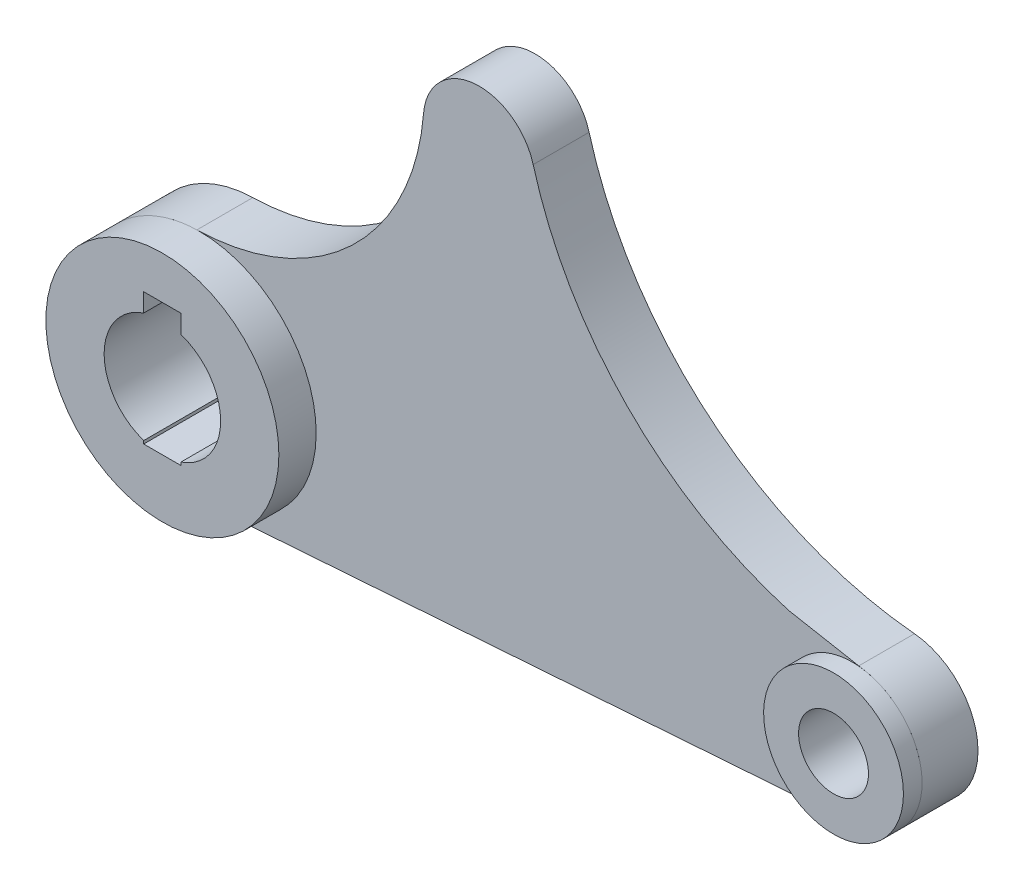
ISO-10303-21;
HEADER;
FILE_DESCRIPTION(('STEP AP214'),'2;1');
FILE_NAME('part.step','',(''),(''),'','','');
FILE_SCHEMA(('AUTOMOTIVE_DESIGN { 1 0 10303 214 1 1 1 1 }'));
ENDSEC;
DATA;
#1=APPLICATION_CONTEXT('core data for automotive mechanical design processes');
#2=APPLICATION_PROTOCOL_DEFINITION('international standard','automotive_design',2000,#1);
#3=PRODUCT_CONTEXT('',#1,'mechanical');
#4=PRODUCT('Part','Part','',(#3));
#5=PRODUCT_RELATED_PRODUCT_CATEGORY('part','',(#4));
#6=PRODUCT_DEFINITION_FORMATION('','',#4);
#7=PRODUCT_DEFINITION_CONTEXT('part definition',#1,'design');
#8=PRODUCT_DEFINITION('design','',#6,#7);
#9=PRODUCT_DEFINITION_SHAPE('','',#8);
#10=(LENGTH_UNIT() NAMED_UNIT(*) SI_UNIT(.MILLI.,.METRE.));
#11=(NAMED_UNIT(*) PLANE_ANGLE_UNIT() SI_UNIT($,.RADIAN.));
#12=(NAMED_UNIT(*) SI_UNIT($,.STERADIAN.) SOLID_ANGLE_UNIT());
#13=UNCERTAINTY_MEASURE_WITH_UNIT(LENGTH_MEASURE(1.E-05),#10,'distance_accuracy_value','');
#14=(GEOMETRIC_REPRESENTATION_CONTEXT(3) GLOBAL_UNCERTAINTY_ASSIGNED_CONTEXT((#13)) GLOBAL_UNIT_ASSIGNED_CONTEXT((#10,
#11,#12)) REPRESENTATION_CONTEXT('',''));
#15=CARTESIAN_POINT('',(0.,0.,0.));
#16=DIRECTION('',(0.,0.,1.));
#17=DIRECTION('',(1.,0.,0.));
#18=AXIS2_PLACEMENT_3D('',#15,#16,#17);
#19=CARTESIAN_POINT('',(0.,0.,0.));
#20=DIRECTION('',(0.,0.,1.));
#21=DIRECTION('',(1.,0.,0.));
#22=AXIS2_PLACEMENT_3D('',#19,#20,#21);
#23=CYLINDRICAL_SURFACE('',#22,12.5);
#24=CARTESIAN_POINT('',(0.,0.,20.));
#25=DIRECTION('',(0.,0.,1.));
#26=DIRECTION('',(1.,0.,0.));
#27=AXIS2_PLACEMENT_3D('',#24,#25,#26);
#28=CIRCLE('',#27,12.5);
#29=CARTESIAN_POINT('',(-4.,11.842719282327,20.));
#30=VERTEX_POINT('',#29);
#31=CARTESIAN_POINT('',(-4.,-11.842719282327,20.));
#32=VERTEX_POINT('',#31);
#33=EDGE_CURVE('E363',#30,#32,#28,.T.);
#34=ORIENTED_EDGE('',*,*,#33,.T.);
#35=DIRECTION('',(0.,0.,1.));
#36=VECTOR('',#35,1.);
#37=CARTESIAN_POINT('',(-4.,-11.842719282327,0.));
#38=LINE('',#37,#36);
#39=CARTESIAN_POINT('',(-4.,-11.842719282327,0.));
#40=VERTEX_POINT('',#39);
#41=EDGE_CURVE('E211',#32,#40,#38,.F.);
#42=ORIENTED_EDGE('',*,*,#41,.T.);
#43=CARTESIAN_POINT('',(0.,0.,0.));
#44=DIRECTION('',(0.,0.,1.));
#45=DIRECTION('',(1.,0.,0.));
#46=AXIS2_PLACEMENT_3D('',#43,#44,#45);
#47=CIRCLE('',#46,12.5);
#48=CARTESIAN_POINT('',(-4.,11.842719282327,0.));
#49=VERTEX_POINT('',#48);
#50=EDGE_CURVE('E378',#49,#40,#47,.T.);
#51=ORIENTED_EDGE('',*,*,#50,.F.);
#52=DIRECTION('',(0.,0.,1.));
#53=VECTOR('',#52,1.);
#54=CARTESIAN_POINT('',(-4.,11.842719282327,0.));
#55=LINE('',#54,#53);
#56=EDGE_CURVE('E215',#49,#30,#55,.T.);
#57=ORIENTED_EDGE('',*,*,#56,.T.);
#58=EDGE_LOOP('',(#34,#42,#51,#57));
#59=FACE_BOUND('',#58,.T.);
#60=ADVANCED_FACE('F45',(#59),#23,.F.);
#61=CARTESIAN_POINT('',(0.000402219123890948,-0.000374377429163478,12.));
#62=DIRECTION('',(0.,0.,-1.));
#63=DIRECTION('',(-1.,0.,0.));
#64=AXIS2_PLACEMENT_3D('',#61,#62,#63);
#65=CYLINDRICAL_SURFACE('',#64,24.9995540058325);
#66=CARTESIAN_POINT('',(0.000402219123890948,-0.000374377429163478,0.));
#67=DIRECTION('',(0.,0.,1.));
#68=DIRECTION('',(1.,0.,0.));
#69=AXIS2_PLACEMENT_3D('',#66,#67,#68);
#70=CIRCLE('',#69,24.9995540058325);
#71=CARTESIAN_POINT('',(-0.598700000000013,24.992,0.));
#72=VERTEX_POINT('',#71);
#73=CARTESIAN_POINT('',(1.7857,-24.9361,0.));
#74=VERTEX_POINT('',#73);
#75=EDGE_CURVE('E263',#72,#74,#70,.T.);
#76=ORIENTED_EDGE('',*,*,#75,.T.);
#77=DIRECTION('',(0.,0.,-1.));
#78=VECTOR('',#77,1.);
#79=CARTESIAN_POINT('',(1.7857,-24.9361,12.));
#80=LINE('',#79,#78);
#81=CARTESIAN_POINT('',(1.7857,-24.9361,12.));
#82=VERTEX_POINT('',#81);
#83=EDGE_CURVE('E303',#82,#74,#80,.T.);
#84=ORIENTED_EDGE('',*,*,#83,.F.);
#85=CARTESIAN_POINT('',(0.000402219123890948,-0.000374377429163478,12.));
#86=DIRECTION('',(0.,0.,1.));
#87=DIRECTION('',(1.,0.,0.));
#88=AXIS2_PLACEMENT_3D('',#85,#86,#87);
#89=CIRCLE('',#88,24.9995540058325);
#90=CARTESIAN_POINT('',(-0.598700000000013,24.992,12.));
#91=VERTEX_POINT('',#90);
#92=EDGE_CURVE('E283',#91,#82,#89,.T.);
#93=ORIENTED_EDGE('',*,*,#92,.F.);
#94=DIRECTION('',(0.,0.,-1.));
#95=VECTOR('',#94,1.);
#96=CARTESIAN_POINT('',(-0.598700000000013,24.992,12.));
#97=LINE('',#96,#95);
#98=EDGE_CURVE('E262',#91,#72,#97,.T.);
#99=ORIENTED_EDGE('',*,*,#98,.T.);
#100=EDGE_LOOP('',(#76,#84,#93,#99));
#101=FACE_BOUND('',#100,.T.);
#102=ADVANCED_FACE('F47',(#101),#65,.T.);
#103=CARTESIAN_POINT('',(1.7857,-24.9361,12.));
#104=DIRECTION('',(-0.0714281713737014,0.997445746060511,0.));
#105=DIRECTION('',(-0.997445746060511,-0.0714281713737014,0.));
#106=AXIS2_PLACEMENT_3D('',#103,#104,#105);
#107=PLANE('',#106);
#108=DIRECTION('',(0.997445746060511,0.0714281713737014,0.));
#109=VECTOR('',#108,1.);
#110=CARTESIAN_POINT('',(1.7857,-24.9361,0.));
#111=LINE('',#110,#109);
#112=CARTESIAN_POINT('',(141.0714,-14.9617,0.));
#113=VERTEX_POINT('',#112);
#114=EDGE_CURVE('E267',#74,#113,#111,.T.);
#115=ORIENTED_EDGE('',*,*,#114,.T.);
#116=DIRECTION('',(0.,0.,-1.));
#117=VECTOR('',#116,1.);
#118=CARTESIAN_POINT('',(141.0714,-14.9617,12.));
#119=LINE('',#118,#117);
#120=CARTESIAN_POINT('',(141.0714,-14.9617,12.));
#121=VERTEX_POINT('',#120);
#122=EDGE_CURVE('E299',#121,#113,#119,.T.);
#123=ORIENTED_EDGE('',*,*,#122,.F.);
#124=DIRECTION('',(0.997445746060511,0.0714281713737014,0.));
#125=VECTOR('',#124,1.);
#126=CARTESIAN_POINT('',(1.7857,-24.9361,12.));
#127=LINE('',#126,#125);
#128=CARTESIAN_POINT('',(1.8324035606038,-24.932755507386,12.));
#129=VERTEX_POINT('',#128);
#130=EDGE_CURVE('E452',#129,#121,#127,.T.);
#131=ORIENTED_EDGE('',*,*,#130,.F.);
#132=EDGE_CURVE('E244',#82,#129,#127,.T.);
#133=ORIENTED_EDGE('',*,*,#132,.F.);
#134=ORIENTED_EDGE('',*,*,#83,.T.);
#135=EDGE_LOOP('',(#115,#123,#131,#133,#134));
#136=FACE_BOUND('',#135,.T.);
#137=ADVANCED_FACE('F328',(#136),#107,.F.);
#138=CARTESIAN_POINT('',(139.999830405286,0.000159451017999433,12.));
#139=DIRECTION('',(0.,0.,-1.));
#140=DIRECTION('',(-1.,0.,0.));
#141=AXIS2_PLACEMENT_3D('',#138,#139,#140);
#142=CYLINDRICAL_SURFACE('',#141,15.0001833198242);
#143=CARTESIAN_POINT('',(139.999830405286,0.000159451017999433,0.));
#144=DIRECTION('',(0.,0.,1.));
#145=DIRECTION('',(1.,0.,0.));
#146=AXIS2_PLACEMENT_3D('',#143,#144,#145);
#147=CIRCLE('',#146,15.0001833198242);
#148=CARTESIAN_POINT('',(141.366,14.938,0.));
#149=VERTEX_POINT('',#148);
#150=EDGE_CURVE('E271',#113,#149,#147,.T.);
#151=ORIENTED_EDGE('',*,*,#150,.T.);
#152=DIRECTION('',(0.,0.,-1.));
#153=VECTOR('',#152,1.);
#154=CARTESIAN_POINT('',(141.366,14.938,12.));
#155=LINE('',#154,#153);
#156=CARTESIAN_POINT('',(141.366,14.938,12.));
#157=VERTEX_POINT('',#156);
#158=EDGE_CURVE('E295',#157,#149,#155,.T.);
#159=ORIENTED_EDGE('',*,*,#158,.F.);
#160=CARTESIAN_POINT('',(139.999830405286,0.000159451017999433,12.));
#161=DIRECTION('',(0.,0.,1.));
#162=DIRECTION('',(1.,0.,0.));
#163=AXIS2_PLACEMENT_3D('',#160,#161,#162);
#164=CIRCLE('',#163,15.0001833198242);
#165=CARTESIAN_POINT('',(154.938540983483,-1.35646352137157,12.));
#166=VERTEX_POINT('',#165);
#167=EDGE_CURVE('E239',#166,#157,#164,.T.);
#168=ORIENTED_EDGE('',*,*,#167,.F.);
#169=CARTESIAN_POINT('',(140.,0.,12.));
#170=DIRECTION('',(0.,0.,1.));
#171=DIRECTION('',(0.151603502002802,-0.988441388338472,0.));
#172=AXIS2_PLACEMENT_3D('',#169,#170,#171);
#173=CIRCLE('',#172,15.);
#174=CARTESIAN_POINT('',(142.274052530042,-14.8266208250771,12.));
#175=VERTEX_POINT('',#174);
#176=EDGE_CURVE('E243',#175,#166,#173,.T.);
#177=ORIENTED_EDGE('',*,*,#176,.F.);
#178=EDGE_CURVE('E245',#121,#175,#164,.T.);
#179=ORIENTED_EDGE('',*,*,#178,.F.);
#180=ORIENTED_EDGE('',*,*,#122,.T.);
#181=EDGE_LOOP('',(#151,#159,#168,#177,#179,#180));
#182=FACE_BOUND('',#181,.T.);
#183=ADVANCED_FACE('F318',(#182),#142,.T.);
#184=CARTESIAN_POINT('',(148.649606252842,94.6071611996893,12.));
#185=DIRECTION('',(0.,0.,-1.));
#186=DIRECTION('',(-1.,0.,0.));
#187=AXIS2_PLACEMENT_3D('',#184,#185,#186);
#188=CYLINDRICAL_SURFACE('',#187,80.0014135269403);
#189=CARTESIAN_POINT('',(148.649606252842,94.6071611996893,0.));
#190=DIRECTION('',(0.,0.,-1.));
#191=DIRECTION('',(-1.,0.,0.));
#192=AXIS2_PLACEMENT_3D('',#189,#190,#191);
#193=CIRCLE('',#192,80.0014135269403);
#194=CARTESIAN_POINT('',(71.563,73.209,0.));
#195=VERTEX_POINT('',#194);
#196=EDGE_CURVE('E274',#149,#195,#193,.T.);
#197=ORIENTED_EDGE('',*,*,#196,.T.);
#198=DIRECTION('',(0.,0.,-1.));
#199=VECTOR('',#198,1.);
#200=CARTESIAN_POINT('',(71.563,73.209,12.));
#201=LINE('',#200,#199);
#202=CARTESIAN_POINT('',(71.563,73.209,12.));
#203=VERTEX_POINT('',#202);
#204=EDGE_CURVE('E291',#203,#195,#201,.T.);
#205=ORIENTED_EDGE('',*,*,#204,.F.);
#206=CARTESIAN_POINT('',(148.649606252842,94.6071611996893,12.));
#207=DIRECTION('',(0.,0.,-1.));
#208=DIRECTION('',(-1.,0.,0.));
#209=AXIS2_PLACEMENT_3D('',#206,#207,#208);
#210=CIRCLE('',#209,80.0014135269403);
#211=EDGE_CURVE('E251',#157,#203,#210,.T.);
#212=ORIENTED_EDGE('',*,*,#211,.F.);
#213=ORIENTED_EDGE('',*,*,#158,.T.);
#214=EDGE_LOOP('',(#197,#205,#212,#213));
#215=FACE_BOUND('',#214,.T.);
#216=ADVANCED_FACE('F327',(#215),#188,.F.);
#217=CARTESIAN_POINT('',(60.0003644791306,70.0005299635653,12.));
#218=DIRECTION('',(0.,0.,-1.));
#219=DIRECTION('',(-1.,0.,0.));
#220=AXIS2_PLACEMENT_3D('',#217,#218,#219);
#221=CYLINDRICAL_SURFACE('',#220,11.9995341644236);
#222=CARTESIAN_POINT('',(60.0003644791306,70.0005299635653,0.));
#223=DIRECTION('',(0.,0.,1.));
#224=DIRECTION('',(1.,0.,0.));
#225=AXIS2_PLACEMENT_3D('',#222,#223,#224);
#226=CIRCLE('',#225,11.9995341644236);
#227=CARTESIAN_POINT('',(48.0395,70.9631,0.));
#228=VERTEX_POINT('',#227);
#229=EDGE_CURVE('E277',#195,#228,#226,.T.);
#230=ORIENTED_EDGE('',*,*,#229,.T.);
#231=DIRECTION('',(0.,0.,-1.));
#232=VECTOR('',#231,1.);
#233=CARTESIAN_POINT('',(48.0395,70.9631,12.));
#234=LINE('',#233,#232);
#235=CARTESIAN_POINT('',(48.0395,70.9631,12.));
#236=VERTEX_POINT('',#235);
#237=EDGE_CURVE('E287',#236,#228,#234,.T.);
#238=ORIENTED_EDGE('',*,*,#237,.F.);
#239=CARTESIAN_POINT('',(60.0003644791306,70.0005299635653,12.));
#240=DIRECTION('',(0.,0.,1.));
#241=DIRECTION('',(1.,0.,0.));
#242=AXIS2_PLACEMENT_3D('',#239,#240,#241);
#243=CIRCLE('',#242,11.9995341644236);
#244=EDGE_CURVE('E255',#203,#236,#243,.T.);
#245=ORIENTED_EDGE('',*,*,#244,.F.);
#246=ORIENTED_EDGE('',*,*,#204,.T.);
#247=EDGE_LOOP('',(#230,#238,#245,#246));
#248=FACE_BOUND('',#247,.T.);
#249=ADVANCED_FACE('F415',(#248),#221,.T.);
#250=CARTESIAN_POINT('',(-1.79683237748626,74.9752127016245,12.));
#251=DIRECTION('',(0.,0.,-1.));
#252=DIRECTION('',(-1.,0.,0.));
#253=AXIS2_PLACEMENT_3D('',#250,#251,#252);
#254=CYLINDRICAL_SURFACE('',#253,49.9975706726819);
#255=CARTESIAN_POINT('',(-1.79683237748626,74.9752127016245,0.));
#256=DIRECTION('',(0.,0.,-1.));
#257=DIRECTION('',(-1.,0.,0.));
#258=AXIS2_PLACEMENT_3D('',#255,#256,#257);
#259=CIRCLE('',#258,49.9975706726819);
#260=EDGE_CURVE('E280',#228,#72,#259,.T.);
#261=ORIENTED_EDGE('',*,*,#260,.T.);
#262=ORIENTED_EDGE('',*,*,#98,.F.);
#263=CARTESIAN_POINT('',(-1.79683237748626,74.9752127016245,12.));
#264=DIRECTION('',(0.,0.,-1.));
#265=DIRECTION('',(-1.,0.,0.));
#266=AXIS2_PLACEMENT_3D('',#263,#264,#265);
#267=CIRCLE('',#266,49.9975706726819);
#268=CARTESIAN_POINT('',(-0.432683514690021,24.9962554190846,12.));
#269=VERTEX_POINT('',#268);
#270=EDGE_CURVE('E258',#269,#91,#267,.T.);
#271=ORIENTED_EDGE('',*,*,#270,.F.);
#272=EDGE_CURVE('E259',#236,#269,#267,.T.);
#273=ORIENTED_EDGE('',*,*,#272,.F.);
#274=ORIENTED_EDGE('',*,*,#237,.T.);
#275=EDGE_LOOP('',(#261,#262,#271,#273,#274));
#276=FACE_BOUND('',#275,.T.);
#277=ADVANCED_FACE('F410',(#276),#254,.F.);
#278=CARTESIAN_POINT('',(0.000402219123890948,-0.000374377429163478,12.));
#279=DIRECTION('',(0.,0.,1.));
#280=DIRECTION('',(1.,0.,0.));
#281=AXIS2_PLACEMENT_3D('',#278,#279,#280);
#282=PLANE('',#281);
#283=CARTESIAN_POINT('',(70.4244385839701,14.9798186483,12.));
#284=DIRECTION('',(0.,0.,1.));
#285=DIRECTION('',(1.,0.,0.));
#286=AXIS2_PLACEMENT_3D('',#283,#284,#285);
#287=CIRCLE('',#286,4.00002356938401);
#288=CARTESIAN_POINT('',(66.514,14.138,12.));
#289=VERTEX_POINT('',#288);
#290=CARTESIAN_POINT('',(74.3392,15.8013,12.));
#291=VERTEX_POINT('',#290);
#292=EDGE_CURVE('E193',#289,#291,#287,.T.);
#293=ORIENTED_EDGE('',*,*,#292,.F.);
#294=CARTESIAN_POINT('',(0.00161020781769966,0.000820441417557355,12.));
#295=DIRECTION('',(0.,0.,1.));
#296=DIRECTION('',(1.,0.,0.));
#297=AXIS2_PLACEMENT_3D('',#294,#295,#296);
#298=CIRCLE('',#297,67.9982194012373);
#299=CARTESIAN_POINT('',(57.6673,36.0345,12.));
#300=VERTEX_POINT('',#299);
#301=EDGE_CURVE('E534',#300,#289,#298,.F.);
#302=ORIENTED_EDGE('',*,*,#301,.F.);
#303=CARTESIAN_POINT('',(61.0595,38.1542,12.));
#304=DIRECTION('',(0.,0.,1.));
#305=DIRECTION('',(1.,0.,0.));
#306=AXIS2_PLACEMENT_3D('',#303,#304,#305);
#307=CIRCLE('',#306,4.00001861620668);
#308=CARTESIAN_POINT('',(64.4517,40.2739,12.));
#309=VERTEX_POINT('',#308);
#310=EDGE_CURVE('E536',#309,#300,#307,.T.);
#311=ORIENTED_EDGE('',*,*,#310,.F.);
#312=CARTESIAN_POINT('',(-0.00226894669665134,-0.000693687040313057,12.));
#313=DIRECTION('',(0.,0.,1.));
#314=DIRECTION('',(1.,0.,0.));
#315=AXIS2_PLACEMENT_3D('',#312,#313,#314);
#316=CIRCLE('',#315,76.0023487113255);
#317=EDGE_CURVE('E540',#291,#309,#316,.T.);
#318=ORIENTED_EDGE('',*,*,#317,.F.);
#319=EDGE_LOOP('',(#293,#302,#311,#318));
#320=FACE_BOUND('',#319,.T.);
#321=CARTESIAN_POINT('',(60.,70.,12.));
#322=DIRECTION('',(0.,0.,1.));
#323=DIRECTION('',(1.,0.,0.));
#324=AXIS2_PLACEMENT_3D('',#321,#322,#323);
#325=CIRCLE('',#324,5.);
#326=CARTESIAN_POINT('',(65.,70.,12.));
#327=VERTEX_POINT('',#326);
#328=EDGE_CURVE('E232',#327,#327,#325,.T.);
#329=ORIENTED_EDGE('',*,*,#328,.F.);
#330=EDGE_LOOP('',(#329));
#331=FACE_BOUND('',#330,.T.);
#332=ORIENTED_EDGE('',*,*,#178,.T.);
#333=CARTESIAN_POINT('',(140.,0.,12.));
#334=DIRECTION('',(0.,0.,1.));
#335=DIRECTION('',(1.,0.,0.));
#336=AXIS2_PLACEMENT_3D('',#333,#334,#335);
#337=CIRCLE('',#336,15.);
#338=EDGE_CURVE('E227',#175,#166,#337,.F.);
#339=ORIENTED_EDGE('',*,*,#338,.T.);
#340=ORIENTED_EDGE('',*,*,#167,.T.);
#341=ORIENTED_EDGE('',*,*,#211,.T.);
#342=ORIENTED_EDGE('',*,*,#244,.T.);
#343=ORIENTED_EDGE('',*,*,#272,.T.);
#344=CARTESIAN_POINT('',(0.,0.,12.));
#345=DIRECTION('',(0.,0.,1.));
#346=DIRECTION('',(1.,0.,0.));
#347=AXIS2_PLACEMENT_3D('',#344,#345,#346);
#348=CIRCLE('',#347,25.);
#349=EDGE_CURVE('E307',#129,#269,#348,.T.);
#350=ORIENTED_EDGE('',*,*,#349,.F.);
#351=ORIENTED_EDGE('',*,*,#130,.T.);
#352=EDGE_LOOP('',(#332,#339,#340,#341,#342,#343,#350,#351));
#353=FACE_BOUND('',#352,.T.);
#354=ADVANCED_FACE('F407',(#320,#331,#353),#282,.T.);
#355=CARTESIAN_POINT('',(0.000402219123890948,-0.000374377429163478,0.));
#356=DIRECTION('',(0.,0.,1.));
#357=DIRECTION('',(1.,0.,0.));
#358=AXIS2_PLACEMENT_3D('',#355,#356,#357);
#359=PLANE('',#358);
#360=CARTESIAN_POINT('',(0.00161020781769966,0.000820441417557355,0.));
#361=DIRECTION('',(0.,0.,1.));
#362=DIRECTION('',(1.,0.,0.));
#363=AXIS2_PLACEMENT_3D('',#360,#361,#362);
#364=CIRCLE('',#363,67.9982194012373);
#365=CARTESIAN_POINT('',(57.6673,36.0345,0.));
#366=VERTEX_POINT('',#365);
#367=CARTESIAN_POINT('',(66.514,14.138,0.));
#368=VERTEX_POINT('',#367);
#369=EDGE_CURVE('E54',#366,#368,#364,.F.);
#370=ORIENTED_EDGE('',*,*,#369,.T.);
#371=CARTESIAN_POINT('',(70.4244385839701,14.9798186483,0.));
#372=DIRECTION('',(0.,0.,1.));
#373=DIRECTION('',(1.,0.,0.));
#374=AXIS2_PLACEMENT_3D('',#371,#372,#373);
#375=CIRCLE('',#374,4.00002356938401);
#376=CARTESIAN_POINT('',(74.3392,15.8013,0.));
#377=VERTEX_POINT('',#376);
#378=EDGE_CURVE('E11',#368,#377,#375,.T.);
#379=ORIENTED_EDGE('',*,*,#378,.T.);
#380=CARTESIAN_POINT('',(-0.00226894669665134,-0.000693687040313057,0.));
#381=DIRECTION('',(0.,0.,1.));
#382=DIRECTION('',(1.,0.,0.));
#383=AXIS2_PLACEMENT_3D('',#380,#381,#382);
#384=CIRCLE('',#383,76.0023487113255);
#385=CARTESIAN_POINT('',(64.4517,40.2739,0.));
#386=VERTEX_POINT('',#385);
#387=EDGE_CURVE('E180',#377,#386,#384,.T.);
#388=ORIENTED_EDGE('',*,*,#387,.T.);
#389=CARTESIAN_POINT('',(61.0595,38.1542,0.));
#390=DIRECTION('',(0.,0.,1.));
#391=DIRECTION('',(1.,0.,0.));
#392=AXIS2_PLACEMENT_3D('',#389,#390,#391);
#393=CIRCLE('',#392,4.00001861620668);
#394=EDGE_CURVE('E185',#386,#366,#393,.T.);
#395=ORIENTED_EDGE('',*,*,#394,.T.);
#396=EDGE_LOOP('',(#370,#379,#388,#395));
#397=FACE_BOUND('',#396,.T.);
#398=CARTESIAN_POINT('',(60.,70.,0.));
#399=DIRECTION('',(0.,0.,1.));
#400=DIRECTION('',(1.,0.,0.));
#401=AXIS2_PLACEMENT_3D('',#398,#399,#400);
#402=CIRCLE('',#401,5.);
#403=CARTESIAN_POINT('',(65.,70.,0.));
#404=VERTEX_POINT('',#403);
#405=EDGE_CURVE('E228',#404,#404,#402,.T.);
#406=ORIENTED_EDGE('',*,*,#405,.T.);
#407=EDGE_LOOP('',(#406));
#408=FACE_BOUND('',#407,.T.);
#409=CARTESIAN_POINT('',(140.,0.,0.));
#410=DIRECTION('',(0.,0.,1.));
#411=DIRECTION('',(1.,0.,0.));
#412=AXIS2_PLACEMENT_3D('',#409,#410,#411);
#413=CIRCLE('',#412,7.50000000000001);
#414=CARTESIAN_POINT('',(147.5,0.,0.));
#415=VERTEX_POINT('',#414);
#416=EDGE_CURVE('E238',#415,#415,#413,.T.);
#417=ORIENTED_EDGE('',*,*,#416,.T.);
#418=EDGE_LOOP('',(#417));
#419=FACE_BOUND('',#418,.T.);
#420=DIRECTION('',(-1.,0.,0.));
#421=VECTOR('',#420,1.);
#422=CARTESIAN_POINT('',(0.000402219123890948,15.8,0.));
#423=LINE('',#422,#421);
#424=CARTESIAN_POINT('',(4.,15.8,0.));
#425=VERTEX_POINT('',#424);
#426=CARTESIAN_POINT('',(-4.,15.8,0.));
#427=VERTEX_POINT('',#426);
#428=EDGE_CURVE('E233',#425,#427,#423,.T.);
#429=ORIENTED_EDGE('',*,*,#428,.T.);
#430=DIRECTION('',(0.,-1.,0.));
#431=VECTOR('',#430,1.);
#432=CARTESIAN_POINT('',(-4.,-0.000374377429163478,0.));
#433=LINE('',#432,#431);
#434=EDGE_CURVE('E500',#427,#49,#433,.T.);
#435=ORIENTED_EDGE('',*,*,#434,.T.);
#436=ORIENTED_EDGE('',*,*,#50,.T.);
#437=CARTESIAN_POINT('',(-4.,-12.5,0.));
#438=VERTEX_POINT('',#437);
#439=EDGE_CURVE('E505',#40,#438,#433,.T.);
#440=ORIENTED_EDGE('',*,*,#439,.T.);
#441=DIRECTION('',(1.,0.,0.));
#442=VECTOR('',#441,1.);
#443=CARTESIAN_POINT('',(0.000402219123890948,-12.5,0.));
#444=LINE('',#443,#442);
#445=CARTESIAN_POINT('',(4.,-12.5,0.));
#446=VERTEX_POINT('',#445);
#447=EDGE_CURVE('E485',#438,#446,#444,.T.);
#448=ORIENTED_EDGE('',*,*,#447,.T.);
#449=DIRECTION('',(0.,1.,0.));
#450=VECTOR('',#449,1.);
#451=CARTESIAN_POINT('',(4.,-0.000374377429163478,0.));
#452=LINE('',#451,#450);
#453=CARTESIAN_POINT('',(4.,-11.842719282327,0.));
#454=VERTEX_POINT('',#453);
#455=EDGE_CURVE('E491',#446,#454,#452,.T.);
#456=ORIENTED_EDGE('',*,*,#455,.T.);
#457=CARTESIAN_POINT('',(4.,11.842719282327,0.));
#458=VERTEX_POINT('',#457);
#459=EDGE_CURVE('E367',#454,#458,#47,.T.);
#460=ORIENTED_EDGE('',*,*,#459,.T.);
#461=EDGE_CURVE('E496',#458,#425,#452,.T.);
#462=ORIENTED_EDGE('',*,*,#461,.T.);
#463=EDGE_LOOP('',(#429,#435,#436,#440,#448,#456,#460,#462));
#464=FACE_BOUND('',#463,.T.);
#465=ORIENTED_EDGE('',*,*,#75,.F.);
#466=ORIENTED_EDGE('',*,*,#260,.F.);
#467=ORIENTED_EDGE('',*,*,#229,.F.);
#468=ORIENTED_EDGE('',*,*,#196,.F.);
#469=ORIENTED_EDGE('',*,*,#150,.F.);
#470=ORIENTED_EDGE('',*,*,#114,.F.);
#471=EDGE_LOOP('',(#465,#466,#467,#468,#469,#470));
#472=FACE_BOUND('',#471,.T.);
#473=ADVANCED_FACE('F198',(#397,#408,#419,#464,#472),#359,.F.);
#474=CARTESIAN_POINT('',(0.,0.,12.));
#475=DIRECTION('',(0.,0.,1.));
#476=DIRECTION('',(1.,0.,0.));
#477=AXIS2_PLACEMENT_3D('',#474,#475,#476);
#478=PLANE('',#477);
#479=ORIENTED_EDGE('',*,*,#92,.T.);
#480=ORIENTED_EDGE('',*,*,#132,.T.);
#481=EDGE_CURVE('E377',#269,#129,#348,.T.);
#482=ORIENTED_EDGE('',*,*,#481,.F.);
#483=ORIENTED_EDGE('',*,*,#270,.T.);
#484=EDGE_LOOP('',(#479,#480,#482,#483));
#485=FACE_BOUND('',#484,.T.);
#486=ADVANCED_FACE('F400',(#485),#478,.F.);
#487=CARTESIAN_POINT('',(0.,0.,20.));
#488=DIRECTION('',(0.,0.,-1.));
#489=DIRECTION('',(-1.,0.,0.));
#490=AXIS2_PLACEMENT_3D('',#487,#488,#489);
#491=CYLINDRICAL_SURFACE('',#490,25.);
#492=CARTESIAN_POINT('',(0.,0.,20.));
#493=DIRECTION('',(0.,0.,1.));
#494=DIRECTION('',(1.,0.,0.));
#495=AXIS2_PLACEMENT_3D('',#492,#493,#494);
#496=CIRCLE('',#495,25.);
#497=CARTESIAN_POINT('',(25.,0.,20.));
#498=VERTEX_POINT('',#497);
#499=EDGE_CURVE('E268',#498,#498,#496,.T.);
#500=ORIENTED_EDGE('',*,*,#499,.F.);
#501=EDGE_LOOP('',(#500));
#502=FACE_BOUND('',#501,.T.);
#503=ORIENTED_EDGE('',*,*,#481,.T.);
#504=ORIENTED_EDGE('',*,*,#349,.T.);
#505=EDGE_LOOP('',(#503,#504));
#506=FACE_BOUND('',#505,.T.);
#507=ADVANCED_FACE('F399',(#502,#506),#491,.T.);
#508=CARTESIAN_POINT('',(0.,0.,20.));
#509=DIRECTION('',(0.,0.,1.));
#510=DIRECTION('',(1.,0.,0.));
#511=AXIS2_PLACEMENT_3D('',#508,#509,#510);
#512=PLANE('',#511);
#513=DIRECTION('',(0.,-1.,0.));
#514=VECTOR('',#513,1.);
#515=CARTESIAN_POINT('',(-4.,0.,20.));
#516=LINE('',#515,#514);
#517=CARTESIAN_POINT('',(-4.,15.8,20.));
#518=VERTEX_POINT('',#517);
#519=EDGE_CURVE('E497',#518,#30,#516,.T.);
#520=ORIENTED_EDGE('',*,*,#519,.F.);
#521=DIRECTION('',(-1.,0.,0.));
#522=VECTOR('',#521,1.);
#523=CARTESIAN_POINT('',(0.,15.8,20.));
#524=LINE('',#523,#522);
#525=CARTESIAN_POINT('',(4.,15.8,20.));
#526=VERTEX_POINT('',#525);
#527=EDGE_CURVE('E186',#526,#518,#524,.T.);
#528=ORIENTED_EDGE('',*,*,#527,.F.);
#529=DIRECTION('',(0.,1.,0.));
#530=VECTOR('',#529,1.);
#531=CARTESIAN_POINT('',(4.,0.,20.));
#532=LINE('',#531,#530);
#533=CARTESIAN_POINT('',(4.,11.842719282327,20.));
#534=VERTEX_POINT('',#533);
#535=EDGE_CURVE('E492',#534,#526,#532,.T.);
#536=ORIENTED_EDGE('',*,*,#535,.F.);
#537=CARTESIAN_POINT('',(4.,-11.842719282327,20.));
#538=VERTEX_POINT('',#537);
#539=EDGE_CURVE('E356',#538,#534,#28,.T.);
#540=ORIENTED_EDGE('',*,*,#539,.F.);
#541=CARTESIAN_POINT('',(4.,-12.5,20.));
#542=VERTEX_POINT('',#541);
#543=EDGE_CURVE('E488',#542,#538,#532,.T.);
#544=ORIENTED_EDGE('',*,*,#543,.F.);
#545=DIRECTION('',(1.,0.,0.));
#546=VECTOR('',#545,1.);
#547=CARTESIAN_POINT('',(0.,-12.5,20.));
#548=LINE('',#547,#546);
#549=CARTESIAN_POINT('',(-4.,-12.5,20.));
#550=VERTEX_POINT('',#549);
#551=EDGE_CURVE('E462',#550,#542,#548,.T.);
#552=ORIENTED_EDGE('',*,*,#551,.F.);
#553=EDGE_CURVE('E501',#32,#550,#516,.T.);
#554=ORIENTED_EDGE('',*,*,#553,.F.);
#555=ORIENTED_EDGE('',*,*,#33,.F.);
#556=EDGE_LOOP('',(#520,#528,#536,#540,#544,#552,#554,#555));
#557=FACE_BOUND('',#556,.T.);
#558=ORIENTED_EDGE('',*,*,#499,.T.);
#559=EDGE_LOOP('',(#558));
#560=FACE_BOUND('',#559,.T.);
#561=ADVANCED_FACE('F395',(#557,#560),#512,.T.);
#562=CARTESIAN_POINT('',(140.,0.,16.));
#563=DIRECTION('',(0.,0.,-1.));
#564=DIRECTION('',(-1.,0.,0.));
#565=AXIS2_PLACEMENT_3D('',#562,#563,#564);
#566=CYLINDRICAL_SURFACE('',#565,15.);
#567=CARTESIAN_POINT('',(140.,0.,16.));
#568=DIRECTION('',(0.,0.,1.));
#569=DIRECTION('',(1.,0.,0.));
#570=AXIS2_PLACEMENT_3D('',#567,#568,#569);
#571=CIRCLE('',#570,15.);
#572=CARTESIAN_POINT('',(155.,0.,16.));
#573=VERTEX_POINT('',#572);
#574=EDGE_CURVE('E373',#573,#573,#571,.T.);
#575=ORIENTED_EDGE('',*,*,#574,.F.);
#576=EDGE_LOOP('',(#575));
#577=FACE_BOUND('',#576,.T.);
#578=ORIENTED_EDGE('',*,*,#176,.T.);
#579=ORIENTED_EDGE('',*,*,#338,.F.);
#580=EDGE_LOOP('',(#578,#579));
#581=FACE_BOUND('',#580,.T.);
#582=ADVANCED_FACE('F352',(#577,#581),#566,.T.);
#583=CARTESIAN_POINT('',(140.,0.,16.));
#584=DIRECTION('',(0.,0.,1.));
#585=DIRECTION('',(1.,0.,0.));
#586=AXIS2_PLACEMENT_3D('',#583,#584,#585);
#587=PLANE('',#586);
#588=CARTESIAN_POINT('',(140.,0.,16.));
#589=DIRECTION('',(0.,0.,1.));
#590=DIRECTION('',(1.,0.,0.));
#591=AXIS2_PLACEMENT_3D('',#588,#589,#590);
#592=CIRCLE('',#591,7.50000000000001);
#593=CARTESIAN_POINT('',(147.5,0.,16.));
#594=VERTEX_POINT('',#593);
#595=EDGE_CURVE('E234',#594,#594,#592,.T.);
#596=ORIENTED_EDGE('',*,*,#595,.F.);
#597=EDGE_LOOP('',(#596));
#598=FACE_BOUND('',#597,.T.);
#599=ORIENTED_EDGE('',*,*,#574,.T.);
#600=EDGE_LOOP('',(#599));
#601=FACE_BOUND('',#600,.T.);
#602=ADVANCED_FACE('F345',(#598,#601),#587,.T.);
#603=ORIENTED_EDGE('',*,*,#539,.T.);
#604=DIRECTION('',(0.,0.,1.));
#605=VECTOR('',#604,1.);
#606=CARTESIAN_POINT('',(4.,11.842719282327,0.));
#607=LINE('',#606,#605);
#608=EDGE_CURVE('E219',#534,#458,#607,.F.);
#609=ORIENTED_EDGE('',*,*,#608,.T.);
#610=ORIENTED_EDGE('',*,*,#459,.F.);
#611=DIRECTION('',(0.,0.,1.));
#612=VECTOR('',#611,1.);
#613=CARTESIAN_POINT('',(4.,-11.842719282327,0.));
#614=LINE('',#613,#612);
#615=EDGE_CURVE('E223',#454,#538,#614,.T.);
#616=ORIENTED_EDGE('',*,*,#615,.T.);
#617=EDGE_LOOP('',(#603,#609,#610,#616));
#618=FACE_BOUND('',#617,.T.);
#619=ADVANCED_FACE('F338',(#618),#23,.F.);
#620=CARTESIAN_POINT('',(140.,0.,-165.));
#621=DIRECTION('',(0.,0.,1.));
#622=DIRECTION('',(1.,0.,0.));
#623=AXIS2_PLACEMENT_3D('',#620,#621,#622);
#624=CYLINDRICAL_SURFACE('',#623,7.50000000000001);
#625=ORIENTED_EDGE('',*,*,#595,.T.);
#626=EDGE_LOOP('',(#625));
#627=FACE_BOUND('',#626,.T.);
#628=ORIENTED_EDGE('',*,*,#416,.F.);
#629=EDGE_LOOP('',(#628));
#630=FACE_BOUND('',#629,.T.);
#631=ADVANCED_FACE('F344',(#627,#630),#624,.F.);
#632=CARTESIAN_POINT('',(60.,70.,-169.));
#633=DIRECTION('',(0.,0.,1.));
#634=DIRECTION('',(1.,0.,0.));
#635=AXIS2_PLACEMENT_3D('',#632,#633,#634);
#636=CYLINDRICAL_SURFACE('',#635,5.);
#637=ORIENTED_EDGE('',*,*,#328,.T.);
#638=EDGE_LOOP('',(#637));
#639=FACE_BOUND('',#638,.T.);
#640=ORIENTED_EDGE('',*,*,#405,.F.);
#641=EDGE_LOOP('',(#640));
#642=FACE_BOUND('',#641,.T.);
#643=ADVANCED_FACE('F350',(#639,#642),#636,.F.);
#644=CARTESIAN_POINT('',(4.,-12.5,-161.));
#645=DIRECTION('',(1.,0.,0.));
#646=DIRECTION('',(0.,0.,-1.));
#647=AXIS2_PLACEMENT_3D('',#644,#645,#646);
#648=PLANE('',#647);
#649=DIRECTION('',(0.,0.,1.));
#650=VECTOR('',#649,1.);
#651=CARTESIAN_POINT('',(4.,-12.5,-161.));
#652=LINE('',#651,#650);
#653=EDGE_CURVE('E470',#446,#542,#652,.T.);
#654=ORIENTED_EDGE('',*,*,#653,.T.);
#655=ORIENTED_EDGE('',*,*,#543,.T.);
#656=ORIENTED_EDGE('',*,*,#615,.F.);
#657=ORIENTED_EDGE('',*,*,#455,.F.);
#658=EDGE_LOOP('',(#654,#655,#656,#657));
#659=FACE_BOUND('',#658,.T.);
#660=ADVANCED_FACE('F519',(#659),#648,.F.);
#661=CARTESIAN_POINT('',(-4.,15.8,-161.));
#662=DIRECTION('',(-1.,0.,0.));
#663=DIRECTION('',(0.,0.,1.));
#664=AXIS2_PLACEMENT_3D('',#661,#662,#663);
#665=PLANE('',#664);
#666=ORIENTED_EDGE('',*,*,#41,.F.);
#667=ORIENTED_EDGE('',*,*,#553,.T.);
#668=DIRECTION('',(0.,0.,1.));
#669=VECTOR('',#668,1.);
#670=CARTESIAN_POINT('',(-4.,-12.5,-161.));
#671=LINE('',#670,#669);
#672=EDGE_CURVE('E477',#438,#550,#671,.T.);
#673=ORIENTED_EDGE('',*,*,#672,.F.);
#674=ORIENTED_EDGE('',*,*,#439,.F.);
#675=EDGE_LOOP('',(#666,#667,#673,#674));
#676=FACE_BOUND('',#675,.T.);
#677=ADVANCED_FACE('F568',(#676),#665,.F.);
#678=CARTESIAN_POINT('',(-4.,-12.5,-161.));
#679=DIRECTION('',(0.,-1.,0.));
#680=DIRECTION('',(0.,0.,-1.));
#681=AXIS2_PLACEMENT_3D('',#678,#679,#680);
#682=PLANE('',#681);
#683=ORIENTED_EDGE('',*,*,#672,.T.);
#684=ORIENTED_EDGE('',*,*,#551,.T.);
#685=ORIENTED_EDGE('',*,*,#653,.F.);
#686=ORIENTED_EDGE('',*,*,#447,.F.);
#687=EDGE_LOOP('',(#683,#684,#685,#686));
#688=FACE_BOUND('',#687,.T.);
#689=ADVANCED_FACE('F563',(#688),#682,.F.);
#690=CARTESIAN_POINT('',(4.,15.8,-161.));
#691=DIRECTION('',(0.,1.,0.));
#692=DIRECTION('',(0.,0.,1.));
#693=AXIS2_PLACEMENT_3D('',#690,#691,#692);
#694=PLANE('',#693);
#695=DIRECTION('',(0.,0.,1.));
#696=VECTOR('',#695,1.);
#697=CARTESIAN_POINT('',(4.,15.8,-161.));
#698=LINE('',#697,#696);
#699=EDGE_CURVE('E463',#425,#526,#698,.T.);
#700=ORIENTED_EDGE('',*,*,#699,.T.);
#701=ORIENTED_EDGE('',*,*,#527,.T.);
#702=DIRECTION('',(0.,0.,1.));
#703=VECTOR('',#702,1.);
#704=CARTESIAN_POINT('',(-4.,15.8,-161.));
#705=LINE('',#704,#703);
#706=EDGE_CURVE('E459',#427,#518,#705,.T.);
#707=ORIENTED_EDGE('',*,*,#706,.F.);
#708=ORIENTED_EDGE('',*,*,#428,.F.);
#709=EDGE_LOOP('',(#700,#701,#707,#708));
#710=FACE_BOUND('',#709,.T.);
#711=ADVANCED_FACE('F529',(#710),#694,.F.);
#712=ORIENTED_EDGE('',*,*,#706,.T.);
#713=ORIENTED_EDGE('',*,*,#519,.T.);
#714=ORIENTED_EDGE('',*,*,#56,.F.);
#715=ORIENTED_EDGE('',*,*,#434,.F.);
#716=EDGE_LOOP('',(#712,#713,#714,#715));
#717=FACE_BOUND('',#716,.T.);
#718=ADVANCED_FACE('F562',(#717),#665,.F.);
#719=ORIENTED_EDGE('',*,*,#608,.F.);
#720=ORIENTED_EDGE('',*,*,#535,.T.);
#721=ORIENTED_EDGE('',*,*,#699,.F.);
#722=ORIENTED_EDGE('',*,*,#461,.F.);
#723=EDGE_LOOP('',(#719,#720,#721,#722));
#724=FACE_BOUND('',#723,.T.);
#725=ADVANCED_FACE('F531',(#724),#648,.F.);
#726=CARTESIAN_POINT('',(70.4244385839701,14.9798186483,-169.));
#727=DIRECTION('',(0.,0.,1.));
#728=DIRECTION('',(1.,0.,0.));
#729=AXIS2_PLACEMENT_3D('',#726,#727,#728);
#730=CYLINDRICAL_SURFACE('',#729,4.00002356938401);
#731=ORIENTED_EDGE('',*,*,#292,.T.);
#732=DIRECTION('',(0.,0.,1.));
#733=VECTOR('',#732,1.);
#734=CARTESIAN_POINT('',(74.3392,15.8013,-169.));
#735=LINE('',#734,#733);
#736=EDGE_CURVE('E61',#377,#291,#735,.T.);
#737=ORIENTED_EDGE('',*,*,#736,.F.);
#738=ORIENTED_EDGE('',*,*,#378,.F.);
#739=DIRECTION('',(0.,0.,1.));
#740=VECTOR('',#739,1.);
#741=CARTESIAN_POINT('',(66.514,14.138,-169.));
#742=LINE('',#741,#740);
#743=EDGE_CURVE('E466',#368,#289,#742,.T.);
#744=ORIENTED_EDGE('',*,*,#743,.T.);
#745=EDGE_LOOP('',(#731,#737,#738,#744));
#746=FACE_BOUND('',#745,.T.);
#747=ADVANCED_FACE('F189',(#746),#730,.F.);
#748=CARTESIAN_POINT('',(0.00161020781769966,0.000820441417557355,-169.));
#749=DIRECTION('',(0.,0.,1.));
#750=DIRECTION('',(1.,0.,0.));
#751=AXIS2_PLACEMENT_3D('',#748,#749,#750);
#752=CYLINDRICAL_SURFACE('',#751,67.9982194012373);
#753=ORIENTED_EDGE('',*,*,#301,.T.);
#754=ORIENTED_EDGE('',*,*,#743,.F.);
#755=ORIENTED_EDGE('',*,*,#369,.F.);
#756=DIRECTION('',(0.,0.,1.));
#757=VECTOR('',#756,1.);
#758=CARTESIAN_POINT('',(57.6673,36.0345,-169.));
#759=LINE('',#758,#757);
#760=EDGE_CURVE('E465',#366,#300,#759,.T.);
#761=ORIENTED_EDGE('',*,*,#760,.T.);
#762=EDGE_LOOP('',(#753,#754,#755,#761));
#763=FACE_BOUND('',#762,.T.);
#764=ADVANCED_FACE('F549',(#763),#752,.T.);
#765=CARTESIAN_POINT('',(61.0595,38.1542,-169.));
#766=DIRECTION('',(0.,0.,1.));
#767=DIRECTION('',(1.,0.,0.));
#768=AXIS2_PLACEMENT_3D('',#765,#766,#767);
#769=CYLINDRICAL_SURFACE('',#768,4.00001861620668);
#770=ORIENTED_EDGE('',*,*,#310,.T.);
#771=ORIENTED_EDGE('',*,*,#760,.F.);
#772=ORIENTED_EDGE('',*,*,#394,.F.);
#773=DIRECTION('',(0.,0.,1.));
#774=VECTOR('',#773,1.);
#775=CARTESIAN_POINT('',(64.4517,40.2739,-169.));
#776=LINE('',#775,#774);
#777=EDGE_CURVE('E66',#386,#309,#776,.T.);
#778=ORIENTED_EDGE('',*,*,#777,.T.);
#779=EDGE_LOOP('',(#770,#771,#772,#778));
#780=FACE_BOUND('',#779,.T.);
#781=ADVANCED_FACE('F548',(#780),#769,.F.);
#782=CARTESIAN_POINT('',(-0.00226894669665134,-0.000693687040313057,-169.));
#783=DIRECTION('',(0.,0.,1.));
#784=DIRECTION('',(1.,0.,0.));
#785=AXIS2_PLACEMENT_3D('',#782,#783,#784);
#786=CYLINDRICAL_SURFACE('',#785,76.0023487113255);
#787=ORIENTED_EDGE('',*,*,#317,.T.);
#788=ORIENTED_EDGE('',*,*,#777,.F.);
#789=ORIENTED_EDGE('',*,*,#387,.F.);
#790=ORIENTED_EDGE('',*,*,#736,.T.);
#791=EDGE_LOOP('',(#787,#788,#789,#790));
#792=FACE_BOUND('',#791,.T.);
#793=ADVANCED_FACE('F181',(#792),#786,.F.);
#794=CLOSED_SHELL('',(#60,#102,#137,#183,#216,#249,#277,#354,#473,#486,#507,#561,#582,#602,#619,
#631,#643,#660,#677,#689,#711,#718,#725,#747,#764,#781,#793));
#795=MANIFOLD_SOLID_BREP('B2',#794);
#796=ADVANCED_BREP_SHAPE_REPRESENTATION('',(#18,#795),#14);
#797=SHAPE_DEFINITION_REPRESENTATION(#9,#796);
ENDSEC;
END-ISO-10303-21;
